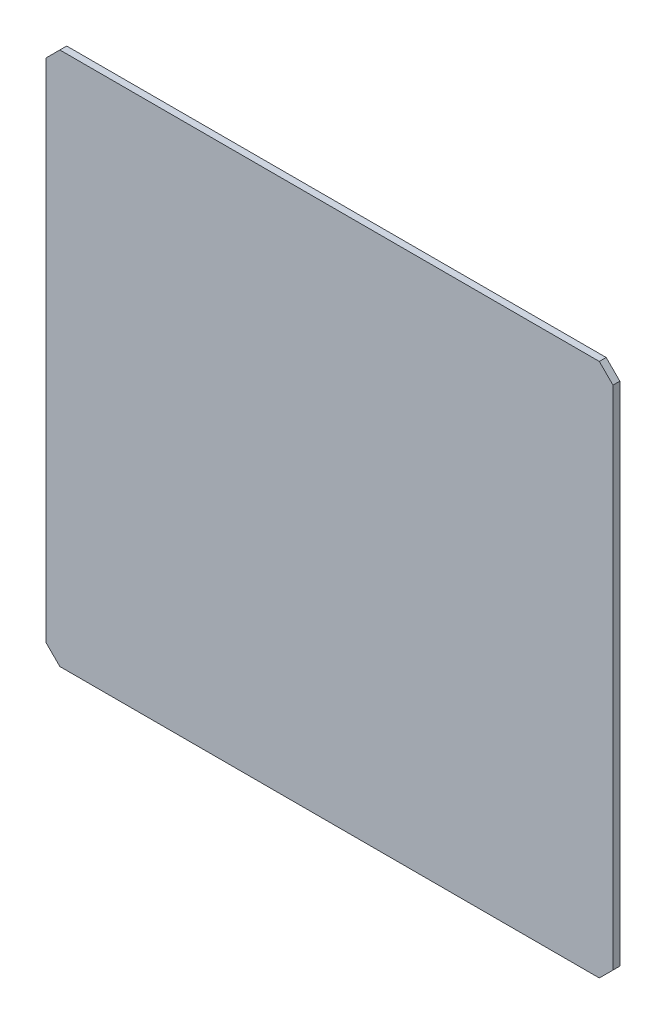
ISO-10303-21;
HEADER;
FILE_DESCRIPTION(('STEP AP214'),'2;1');
FILE_NAME('part.step','',(''),(''),'','','');
FILE_SCHEMA(('AUTOMOTIVE_DESIGN { 1 0 10303 214 1 1 1 1 }'));
ENDSEC;
DATA;
#1=APPLICATION_CONTEXT('core data for automotive mechanical design processes');
#2=APPLICATION_PROTOCOL_DEFINITION('international standard','automotive_design',2000,#1);
#3=PRODUCT_CONTEXT('',#1,'mechanical');
#4=PRODUCT('Part','Part','',(#3));
#5=PRODUCT_RELATED_PRODUCT_CATEGORY('part','',(#4));
#6=PRODUCT_DEFINITION_FORMATION('','',#4);
#7=PRODUCT_DEFINITION_CONTEXT('part definition',#1,'design');
#8=PRODUCT_DEFINITION('design','',#6,#7);
#9=PRODUCT_DEFINITION_SHAPE('','',#8);
#10=(LENGTH_UNIT() NAMED_UNIT(*) SI_UNIT(.MILLI.,.METRE.));
#11=(NAMED_UNIT(*) PLANE_ANGLE_UNIT() SI_UNIT($,.RADIAN.));
#12=(NAMED_UNIT(*) SI_UNIT($,.STERADIAN.) SOLID_ANGLE_UNIT());
#13=UNCERTAINTY_MEASURE_WITH_UNIT(LENGTH_MEASURE(1.E-05),#10,'distance_accuracy_value','');
#14=(GEOMETRIC_REPRESENTATION_CONTEXT(3) GLOBAL_UNCERTAINTY_ASSIGNED_CONTEXT((#13)) GLOBAL_UNIT_ASSIGNED_CONTEXT((#10,
#11,#12)) REPRESENTATION_CONTEXT('',''));
#15=CARTESIAN_POINT('',(0.,0.,0.));
#16=DIRECTION('',(0.,0.,1.));
#17=DIRECTION('',(1.,0.,0.));
#18=AXIS2_PLACEMENT_3D('',#15,#16,#17);
#19=CARTESIAN_POINT('',(-197.,-195.,5.));
#20=DIRECTION('',(-0.707106781186548,-0.707106781186548,0.));
#21=DIRECTION('',(0.707106781186548,-0.707106781186548,0.));
#22=AXIS2_PLACEMENT_3D('',#19,#20,#21);
#23=PLANE('',#22);
#24=DIRECTION('',(-0.707106781186547,0.707106781186547,0.));
#25=VECTOR('',#24,1.);
#26=CARTESIAN_POINT('',(-197.,-195.,0.));
#27=LINE('',#26,#25);
#28=CARTESIAN_POINT('',(-197.,-195.,0.));
#29=VERTEX_POINT('',#28);
#30=CARTESIAN_POINT('',(-207.,-185.,0.));
#31=VERTEX_POINT('',#30);
#32=EDGE_CURVE('E129',#29,#31,#27,.T.);
#33=ORIENTED_EDGE('',*,*,#32,.F.);
#34=DIRECTION('',(0.,0.,-1.));
#35=VECTOR('',#34,1.);
#36=CARTESIAN_POINT('',(-197.,-195.,5.));
#37=LINE('',#36,#35);
#38=CARTESIAN_POINT('',(-197.,-195.,5.));
#39=VERTEX_POINT('',#38);
#40=EDGE_CURVE('E11',#39,#29,#37,.T.);
#41=ORIENTED_EDGE('',*,*,#40,.F.);
#42=DIRECTION('',(-0.707106781186547,0.707106781186547,0.));
#43=VECTOR('',#42,1.);
#44=CARTESIAN_POINT('',(-197.,-195.,5.));
#45=LINE('',#44,#43);
#46=CARTESIAN_POINT('',(-207.,-185.,5.));
#47=VERTEX_POINT('',#46);
#48=EDGE_CURVE('E148',#39,#47,#45,.T.);
#49=ORIENTED_EDGE('',*,*,#48,.T.);
#50=DIRECTION('',(0.,0.,-1.));
#51=VECTOR('',#50,1.);
#52=CARTESIAN_POINT('',(-207.,-185.,5.));
#53=LINE('',#52,#51);
#54=EDGE_CURVE('E36',#47,#31,#53,.T.);
#55=ORIENTED_EDGE('',*,*,#54,.T.);
#56=EDGE_LOOP('',(#33,#41,#49,#55));
#57=FACE_BOUND('',#56,.T.);
#58=ADVANCED_FACE('F33',(#57),#23,.T.);
#59=CARTESIAN_POINT('',(197.,-195.,5.));
#60=DIRECTION('',(0.,-1.,0.));
#61=DIRECTION('',(1.,0.,0.));
#62=AXIS2_PLACEMENT_3D('',#59,#60,#61);
#63=PLANE('',#62);
#64=DIRECTION('',(-1.,0.,0.));
#65=VECTOR('',#64,1.);
#66=CARTESIAN_POINT('',(197.,-195.,0.));
#67=LINE('',#66,#65);
#68=CARTESIAN_POINT('',(197.,-195.,0.));
#69=VERTEX_POINT('',#68);
#70=EDGE_CURVE('E146',#69,#29,#67,.T.);
#71=ORIENTED_EDGE('',*,*,#70,.F.);
#72=DIRECTION('',(0.,0.,-1.));
#73=VECTOR('',#72,1.);
#74=CARTESIAN_POINT('',(197.,-195.,5.));
#75=LINE('',#74,#73);
#76=CARTESIAN_POINT('',(197.,-195.,5.));
#77=VERTEX_POINT('',#76);
#78=EDGE_CURVE('E42',#77,#69,#75,.T.);
#79=ORIENTED_EDGE('',*,*,#78,.F.);
#80=DIRECTION('',(-1.,0.,0.));
#81=VECTOR('',#80,1.);
#82=CARTESIAN_POINT('',(197.,-195.,5.));
#83=LINE('',#82,#81);
#84=EDGE_CURVE('E109',#77,#39,#83,.T.);
#85=ORIENTED_EDGE('',*,*,#84,.T.);
#86=ORIENTED_EDGE('',*,*,#40,.T.);
#87=EDGE_LOOP('',(#71,#79,#85,#86));
#88=FACE_BOUND('',#87,.T.);
#89=ADVANCED_FACE('F161',(#88),#63,.T.);
#90=CARTESIAN_POINT('',(197.,-195.,5.));
#91=DIRECTION('',(-0.707106781186548,0.707106781186548,0.));
#92=DIRECTION('',(-0.707106781186548,-0.707106781186548,0.));
#93=AXIS2_PLACEMENT_3D('',#90,#91,#92);
#94=PLANE('',#93);
#95=DIRECTION('',(0.707106781186547,0.707106781186547,0.));
#96=VECTOR('',#95,1.);
#97=CARTESIAN_POINT('',(197.,-195.,0.));
#98=LINE('',#97,#96);
#99=CARTESIAN_POINT('',(207.,-185.,0.));
#100=VERTEX_POINT('',#99);
#101=EDGE_CURVE('E114',#69,#100,#98,.T.);
#102=ORIENTED_EDGE('',*,*,#101,.T.);
#103=DIRECTION('',(0.,0.,-1.));
#104=VECTOR('',#103,1.);
#105=CARTESIAN_POINT('',(207.,-185.,5.));
#106=LINE('',#105,#104);
#107=CARTESIAN_POINT('',(207.,-185.,5.));
#108=VERTEX_POINT('',#107);
#109=EDGE_CURVE('E112',#108,#100,#106,.T.);
#110=ORIENTED_EDGE('',*,*,#109,.F.);
#111=DIRECTION('',(0.707106781186547,0.707106781186547,0.));
#112=VECTOR('',#111,1.);
#113=CARTESIAN_POINT('',(197.,-195.,5.));
#114=LINE('',#113,#112);
#115=EDGE_CURVE('E103',#77,#108,#114,.T.);
#116=ORIENTED_EDGE('',*,*,#115,.F.);
#117=ORIENTED_EDGE('',*,*,#78,.T.);
#118=EDGE_LOOP('',(#102,#110,#116,#117));
#119=FACE_BOUND('',#118,.T.);
#120=ADVANCED_FACE('F113',(#119),#94,.F.);
#121=CARTESIAN_POINT('',(207.,-185.,5.));
#122=DIRECTION('',(-1.,0.,0.));
#123=DIRECTION('',(0.,0.,1.));
#124=AXIS2_PLACEMENT_3D('',#121,#122,#123);
#125=PLANE('',#124);
#126=DIRECTION('',(0.,1.,0.));
#127=VECTOR('',#126,1.);
#128=CARTESIAN_POINT('',(207.,-185.,0.));
#129=LINE('',#128,#127);
#130=CARTESIAN_POINT('',(207.,185.,0.));
#131=VERTEX_POINT('',#130);
#132=EDGE_CURVE('E143',#100,#131,#129,.T.);
#133=ORIENTED_EDGE('',*,*,#132,.T.);
#134=DIRECTION('',(0.,0.,-1.));
#135=VECTOR('',#134,1.);
#136=CARTESIAN_POINT('',(207.,185.,5.));
#137=LINE('',#136,#135);
#138=CARTESIAN_POINT('',(207.,185.,5.));
#139=VERTEX_POINT('',#138);
#140=EDGE_CURVE('E117',#139,#131,#137,.T.);
#141=ORIENTED_EDGE('',*,*,#140,.F.);
#142=DIRECTION('',(0.,1.,0.));
#143=VECTOR('',#142,1.);
#144=CARTESIAN_POINT('',(207.,-185.,5.));
#145=LINE('',#144,#143);
#146=EDGE_CURVE('E107',#108,#139,#145,.T.);
#147=ORIENTED_EDGE('',*,*,#146,.F.);
#148=ORIENTED_EDGE('',*,*,#109,.T.);
#149=EDGE_LOOP('',(#133,#141,#147,#148));
#150=FACE_BOUND('',#149,.T.);
#151=ADVANCED_FACE('F119',(#150),#125,.F.);
#152=CARTESIAN_POINT('',(207.,185.,5.));
#153=DIRECTION('',(-0.707106781186548,-0.707106781186548,0.));
#154=DIRECTION('',(0.707106781186548,-0.707106781186548,0.));
#155=AXIS2_PLACEMENT_3D('',#152,#153,#154);
#156=PLANE('',#155);
#157=DIRECTION('',(-0.707106781186547,0.707106781186547,0.));
#158=VECTOR('',#157,1.);
#159=CARTESIAN_POINT('',(207.,185.,0.));
#160=LINE('',#159,#158);
#161=CARTESIAN_POINT('',(197.,195.,0.));
#162=VERTEX_POINT('',#161);
#163=EDGE_CURVE('E141',#131,#162,#160,.T.);
#164=ORIENTED_EDGE('',*,*,#163,.T.);
#165=DIRECTION('',(0.,0.,-1.));
#166=VECTOR('',#165,1.);
#167=CARTESIAN_POINT('',(197.,195.,5.));
#168=LINE('',#167,#166);
#169=CARTESIAN_POINT('',(197.,195.,5.));
#170=VERTEX_POINT('',#169);
#171=EDGE_CURVE('E152',#170,#162,#168,.T.);
#172=ORIENTED_EDGE('',*,*,#171,.F.);
#173=DIRECTION('',(-0.707106781186547,0.707106781186547,0.));
#174=VECTOR('',#173,1.);
#175=CARTESIAN_POINT('',(207.,185.,5.));
#176=LINE('',#175,#174);
#177=EDGE_CURVE('E122',#139,#170,#176,.T.);
#178=ORIENTED_EDGE('',*,*,#177,.F.);
#179=ORIENTED_EDGE('',*,*,#140,.T.);
#180=EDGE_LOOP('',(#164,#172,#178,#179));
#181=FACE_BOUND('',#180,.T.);
#182=ADVANCED_FACE('F174',(#181),#156,.F.);
#183=CARTESIAN_POINT('',(197.,195.,5.));
#184=DIRECTION('',(0.,-1.,0.));
#185=DIRECTION('',(1.,0.,0.));
#186=AXIS2_PLACEMENT_3D('',#183,#184,#185);
#187=PLANE('',#186);
#188=DIRECTION('',(-1.,0.,0.));
#189=VECTOR('',#188,1.);
#190=CARTESIAN_POINT('',(197.,195.,0.));
#191=LINE('',#190,#189);
#192=CARTESIAN_POINT('',(-197.,195.,0.));
#193=VERTEX_POINT('',#192);
#194=EDGE_CURVE('E138',#162,#193,#191,.T.);
#195=ORIENTED_EDGE('',*,*,#194,.T.);
#196=DIRECTION('',(0.,0.,-1.));
#197=VECTOR('',#196,1.);
#198=CARTESIAN_POINT('',(-197.,195.,5.));
#199=LINE('',#198,#197);
#200=CARTESIAN_POINT('',(-197.,195.,5.));
#201=VERTEX_POINT('',#200);
#202=EDGE_CURVE('E155',#201,#193,#199,.T.);
#203=ORIENTED_EDGE('',*,*,#202,.F.);
#204=DIRECTION('',(-1.,0.,0.));
#205=VECTOR('',#204,1.);
#206=CARTESIAN_POINT('',(197.,195.,5.));
#207=LINE('',#206,#205);
#208=EDGE_CURVE('E124',#170,#201,#207,.T.);
#209=ORIENTED_EDGE('',*,*,#208,.F.);
#210=ORIENTED_EDGE('',*,*,#171,.T.);
#211=EDGE_LOOP('',(#195,#203,#209,#210));
#212=FACE_BOUND('',#211,.T.);
#213=ADVANCED_FACE('F177',(#212),#187,.F.);
#214=CARTESIAN_POINT('',(-207.,185.,5.));
#215=DIRECTION('',(-0.707106781186548,0.707106781186548,0.));
#216=DIRECTION('',(-0.707106781186548,-0.707106781186548,0.));
#217=AXIS2_PLACEMENT_3D('',#214,#215,#216);
#218=PLANE('',#217);
#219=DIRECTION('',(0.707106781186547,0.707106781186547,0.));
#220=VECTOR('',#219,1.);
#221=CARTESIAN_POINT('',(-207.,185.,0.));
#222=LINE('',#221,#220);
#223=CARTESIAN_POINT('',(-207.,185.,0.));
#224=VERTEX_POINT('',#223);
#225=EDGE_CURVE('E135',#224,#193,#222,.T.);
#226=ORIENTED_EDGE('',*,*,#225,.F.);
#227=DIRECTION('',(0.,0.,-1.));
#228=VECTOR('',#227,1.);
#229=CARTESIAN_POINT('',(-207.,185.,5.));
#230=LINE('',#229,#228);
#231=CARTESIAN_POINT('',(-207.,185.,5.));
#232=VERTEX_POINT('',#231);
#233=EDGE_CURVE('E156',#232,#224,#230,.T.);
#234=ORIENTED_EDGE('',*,*,#233,.F.);
#235=DIRECTION('',(0.707106781186547,0.707106781186547,0.));
#236=VECTOR('',#235,1.);
#237=CARTESIAN_POINT('',(-207.,185.,5.));
#238=LINE('',#237,#236);
#239=EDGE_CURVE('E253',#232,#201,#238,.T.);
#240=ORIENTED_EDGE('',*,*,#239,.T.);
#241=ORIENTED_EDGE('',*,*,#202,.T.);
#242=EDGE_LOOP('',(#226,#234,#240,#241));
#243=FACE_BOUND('',#242,.T.);
#244=ADVANCED_FACE('F181',(#243),#218,.T.);
#245=CARTESIAN_POINT('',(-207.,-185.,5.));
#246=DIRECTION('',(-1.,0.,0.));
#247=DIRECTION('',(0.,0.,1.));
#248=AXIS2_PLACEMENT_3D('',#245,#246,#247);
#249=PLANE('',#248);
#250=DIRECTION('',(0.,1.,0.));
#251=VECTOR('',#250,1.);
#252=CARTESIAN_POINT('',(-207.,-185.,0.));
#253=LINE('',#252,#251);
#254=EDGE_CURVE('E132',#31,#224,#253,.T.);
#255=ORIENTED_EDGE('',*,*,#254,.F.);
#256=ORIENTED_EDGE('',*,*,#54,.F.);
#257=DIRECTION('',(0.,1.,0.));
#258=VECTOR('',#257,1.);
#259=CARTESIAN_POINT('',(-207.,-185.,5.));
#260=LINE('',#259,#258);
#261=EDGE_CURVE('E254',#47,#232,#260,.T.);
#262=ORIENTED_EDGE('',*,*,#261,.T.);
#263=ORIENTED_EDGE('',*,*,#233,.T.);
#264=EDGE_LOOP('',(#255,#256,#262,#263));
#265=FACE_BOUND('',#264,.T.);
#266=ADVANCED_FACE('F158',(#265),#249,.T.);
#267=CARTESIAN_POINT('',(0.,0.,5.));
#268=DIRECTION('',(0.,0.,-1.));
#269=DIRECTION('',(-1.,0.,0.));
#270=AXIS2_PLACEMENT_3D('',#267,#268,#269);
#271=PLANE('',#270);
#272=ORIENTED_EDGE('',*,*,#48,.F.);
#273=ORIENTED_EDGE('',*,*,#84,.F.);
#274=ORIENTED_EDGE('',*,*,#115,.T.);
#275=ORIENTED_EDGE('',*,*,#146,.T.);
#276=ORIENTED_EDGE('',*,*,#177,.T.);
#277=ORIENTED_EDGE('',*,*,#208,.T.);
#278=ORIENTED_EDGE('',*,*,#239,.F.);
#279=ORIENTED_EDGE('',*,*,#261,.F.);
#280=EDGE_LOOP('',(#272,#273,#274,#275,#276,#277,#278,#279));
#281=FACE_BOUND('',#280,.T.);
#282=ADVANCED_FACE('F105',(#281),#271,.F.);
#283=CARTESIAN_POINT('',(0.,0.,0.));
#284=DIRECTION('',(0.,0.,-1.));
#285=DIRECTION('',(-1.,0.,0.));
#286=AXIS2_PLACEMENT_3D('',#283,#284,#285);
#287=PLANE('',#286);
#288=ORIENTED_EDGE('',*,*,#32,.T.);
#289=ORIENTED_EDGE('',*,*,#254,.T.);
#290=ORIENTED_EDGE('',*,*,#225,.T.);
#291=ORIENTED_EDGE('',*,*,#194,.F.);
#292=ORIENTED_EDGE('',*,*,#163,.F.);
#293=ORIENTED_EDGE('',*,*,#132,.F.);
#294=ORIENTED_EDGE('',*,*,#101,.F.);
#295=ORIENTED_EDGE('',*,*,#70,.T.);
#296=EDGE_LOOP('',(#288,#289,#290,#291,#292,#293,#294,#295));
#297=FACE_BOUND('',#296,.T.);
#298=ADVANCED_FACE('F160',(#297),#287,.T.);
#299=CLOSED_SHELL('',(#58,#89,#120,#151,#182,#213,#244,#266,#282,#298));
#300=MANIFOLD_SOLID_BREP('B2',#299);
#301=ADVANCED_BREP_SHAPE_REPRESENTATION('',(#18,#300),#14);
#302=SHAPE_DEFINITION_REPRESENTATION(#9,#301);
ENDSEC;
END-ISO-10303-21;
